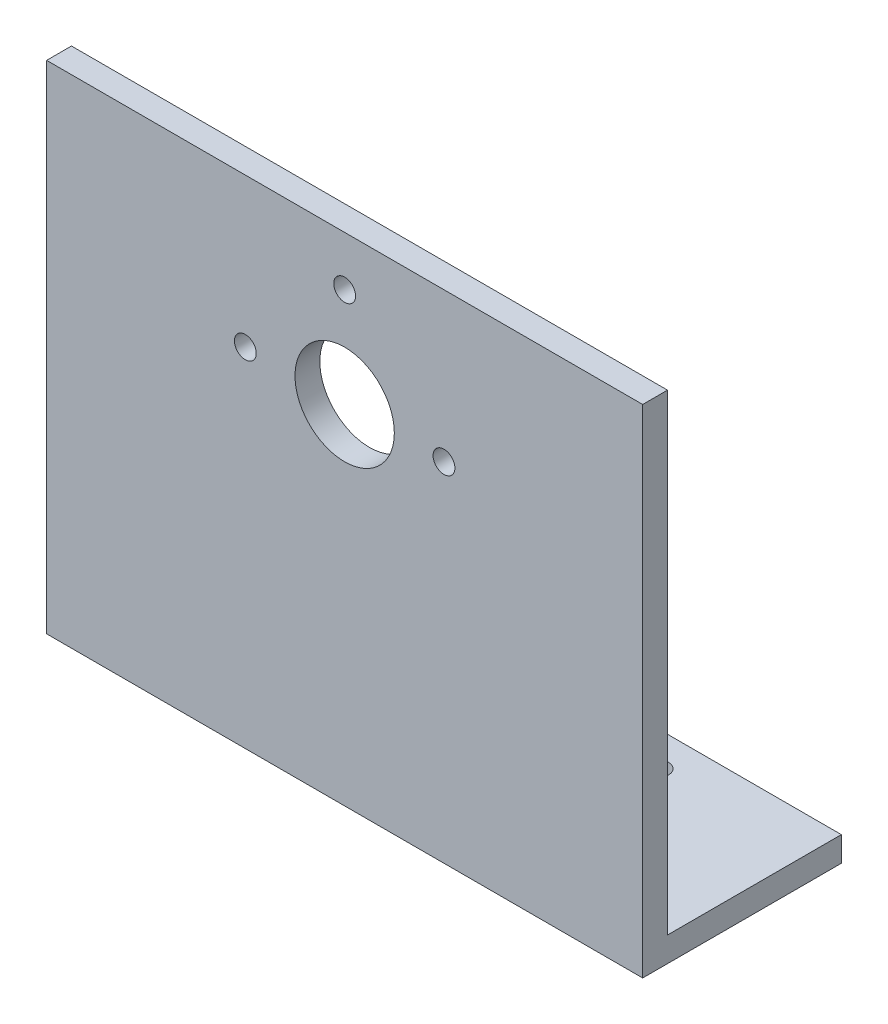
ISO-10303-21;
HEADER;
FILE_DESCRIPTION(('STEP AP214'),'2;1');
FILE_NAME('part.step','',(''),(''),'','','');
FILE_SCHEMA(('AUTOMOTIVE_DESIGN { 1 0 10303 214 1 1 1 1 }'));
ENDSEC;
DATA;
#1=APPLICATION_CONTEXT('core data for automotive mechanical design processes');
#2=APPLICATION_PROTOCOL_DEFINITION('international standard','automotive_design',2000,#1);
#3=PRODUCT_CONTEXT('',#1,'mechanical');
#4=PRODUCT('Part','Part','',(#3));
#5=PRODUCT_RELATED_PRODUCT_CATEGORY('part','',(#4));
#6=PRODUCT_DEFINITION_FORMATION('','',#4);
#7=PRODUCT_DEFINITION_CONTEXT('part definition',#1,'design');
#8=PRODUCT_DEFINITION('design','',#6,#7);
#9=PRODUCT_DEFINITION_SHAPE('','',#8);
#10=(LENGTH_UNIT() NAMED_UNIT(*) SI_UNIT(.MILLI.,.METRE.));
#11=(NAMED_UNIT(*) PLANE_ANGLE_UNIT() SI_UNIT($,.RADIAN.));
#12=(NAMED_UNIT(*) SI_UNIT($,.STERADIAN.) SOLID_ANGLE_UNIT());
#13=UNCERTAINTY_MEASURE_WITH_UNIT(LENGTH_MEASURE(1.E-05),#10,'distance_accuracy_value','');
#14=(GEOMETRIC_REPRESENTATION_CONTEXT(3) GLOBAL_UNCERTAINTY_ASSIGNED_CONTEXT((#13)) GLOBAL_UNIT_ASSIGNED_CONTEXT((#10,
#11,#12)) REPRESENTATION_CONTEXT('',''));
#15=CARTESIAN_POINT('',(0.,0.,0.));
#16=DIRECTION('',(0.,0.,1.));
#17=DIRECTION('',(1.,0.,0.));
#18=AXIS2_PLACEMENT_3D('',#15,#16,#17);
#19=CARTESIAN_POINT('',(-38.1,-44.45,3.175));
#20=DIRECTION('',(0.,0.,-1.));
#21=DIRECTION('',(-1.,0.,0.));
#22=AXIS2_PLACEMENT_3D('',#19,#20,#21);
#23=PLANE('',#22);
#24=CARTESIAN_POINT('',(-12.7,0.,3.175));
#25=DIRECTION('',(0.,0.,1.));
#26=DIRECTION('',(1.,0.,0.));
#27=AXIS2_PLACEMENT_3D('',#24,#25,#26);
#28=CIRCLE('',#27,1.397);
#29=CARTESIAN_POINT('',(-11.303,0.,3.175));
#30=VERTEX_POINT('',#29);
#31=EDGE_CURVE('E149',#30,#30,#28,.T.);
#32=ORIENTED_EDGE('',*,*,#31,.F.);
#33=EDGE_LOOP('',(#32));
#34=FACE_BOUND('',#33,.T.);
#35=CARTESIAN_POINT('',(0.,0.,3.175));
#36=DIRECTION('',(0.,0.,1.));
#37=DIRECTION('',(1.,0.,0.));
#38=AXIS2_PLACEMENT_3D('',#35,#36,#37);
#39=CIRCLE('',#38,6.35);
#40=CARTESIAN_POINT('',(6.35,0.,3.175));
#41=VERTEX_POINT('',#40);
#42=EDGE_CURVE('E161',#41,#41,#39,.T.);
#43=ORIENTED_EDGE('',*,*,#42,.F.);
#44=EDGE_LOOP('',(#43));
#45=FACE_BOUND('',#44,.T.);
#46=DIRECTION('',(0.,-1.,0.));
#47=VECTOR('',#46,1.);
#48=CARTESIAN_POINT('',(-38.1,19.0500000000001,3.175));
#49=LINE('',#48,#47);
#50=CARTESIAN_POINT('',(-38.1,19.0500000000001,3.175));
#51=VERTEX_POINT('',#50);
#52=CARTESIAN_POINT('',(-38.1,-44.45,3.175));
#53=VERTEX_POINT('',#52);
#54=EDGE_CURVE('E167',#51,#53,#49,.T.);
#55=ORIENTED_EDGE('',*,*,#54,.T.);
#56=DIRECTION('',(1.,0.,0.));
#57=VECTOR('',#56,1.);
#58=CARTESIAN_POINT('',(38.1,-44.45,3.175));
#59=LINE('',#58,#57);
#60=CARTESIAN_POINT('',(38.1,-44.45,3.175));
#61=VERTEX_POINT('',#60);
#62=EDGE_CURVE('E81',#53,#61,#59,.T.);
#63=ORIENTED_EDGE('',*,*,#62,.T.);
#64=DIRECTION('',(0.,1.,0.));
#65=VECTOR('',#64,1.);
#66=CARTESIAN_POINT('',(38.1,19.0500000000001,3.175));
#67=LINE('',#66,#65);
#68=CARTESIAN_POINT('',(38.1,19.0500000000001,3.175));
#69=VERTEX_POINT('',#68);
#70=EDGE_CURVE('E103',#61,#69,#67,.T.);
#71=ORIENTED_EDGE('',*,*,#70,.T.);
#72=DIRECTION('',(-1.,0.,0.));
#73=VECTOR('',#72,1.);
#74=CARTESIAN_POINT('',(38.1,19.0500000000001,3.175));
#75=LINE('',#74,#73);
#76=EDGE_CURVE('E59',#69,#51,#75,.T.);
#77=ORIENTED_EDGE('',*,*,#76,.T.);
#78=EDGE_LOOP('',(#55,#63,#71,#77));
#79=FACE_BOUND('',#78,.T.);
#80=CARTESIAN_POINT('',(0.,12.7,3.175));
#81=DIRECTION('',(0.,0.,1.));
#82=DIRECTION('',(1.,0.,0.));
#83=AXIS2_PLACEMENT_3D('',#80,#81,#82);
#84=CIRCLE('',#83,1.397);
#85=CARTESIAN_POINT('',(1.397,12.7,3.175));
#86=VERTEX_POINT('',#85);
#87=EDGE_CURVE('E155',#86,#86,#84,.T.);
#88=ORIENTED_EDGE('',*,*,#87,.F.);
#89=EDGE_LOOP('',(#88));
#90=FACE_BOUND('',#89,.T.);
#91=CARTESIAN_POINT('',(12.7,0.,3.175));
#92=DIRECTION('',(0.,0.,1.));
#93=DIRECTION('',(1.,0.,0.));
#94=AXIS2_PLACEMENT_3D('',#91,#92,#93);
#95=CIRCLE('',#94,1.397);
#96=CARTESIAN_POINT('',(14.097,0.,3.175));
#97=VERTEX_POINT('',#96);
#98=EDGE_CURVE('E129',#97,#97,#95,.T.);
#99=ORIENTED_EDGE('',*,*,#98,.F.);
#100=EDGE_LOOP('',(#99));
#101=FACE_BOUND('',#100,.T.);
#102=ADVANCED_FACE('F33',(#34,#45,#79,#90,#101),#23,.F.);
#103=CARTESIAN_POINT('',(-38.1,-44.45,0.));
#104=DIRECTION('',(0.,0.,-1.));
#105=DIRECTION('',(-1.,0.,0.));
#106=AXIS2_PLACEMENT_3D('',#103,#104,#105);
#107=PLANE('',#106);
#108=DIRECTION('',(1.,0.,0.));
#109=VECTOR('',#108,1.);
#110=CARTESIAN_POINT('',(38.1,-41.275,0.));
#111=LINE('',#110,#109);
#112=CARTESIAN_POINT('',(-38.1,-41.275,0.));
#113=VERTEX_POINT('',#112);
#114=CARTESIAN_POINT('',(38.1,-41.275,0.));
#115=VERTEX_POINT('',#114);
#116=EDGE_CURVE('E50',#113,#115,#111,.T.);
#117=ORIENTED_EDGE('',*,*,#116,.F.);
#118=DIRECTION('',(0.,-1.,0.));
#119=VECTOR('',#118,1.);
#120=CARTESIAN_POINT('',(-38.1,19.0500000000001,0.));
#121=LINE('',#120,#119);
#122=CARTESIAN_POINT('',(-38.1,19.0500000000001,0.));
#123=VERTEX_POINT('',#122);
#124=EDGE_CURVE('E164',#123,#113,#121,.T.);
#125=ORIENTED_EDGE('',*,*,#124,.F.);
#126=DIRECTION('',(-1.,0.,0.));
#127=VECTOR('',#126,1.);
#128=CARTESIAN_POINT('',(38.1,19.0500000000001,0.));
#129=LINE('',#128,#127);
#130=CARTESIAN_POINT('',(38.1,19.0500000000001,0.));
#131=VERTEX_POINT('',#130);
#132=EDGE_CURVE('E74',#131,#123,#129,.T.);
#133=ORIENTED_EDGE('',*,*,#132,.F.);
#134=DIRECTION('',(0.,1.,0.));
#135=VECTOR('',#134,1.);
#136=CARTESIAN_POINT('',(38.1,19.0500000000001,0.));
#137=LINE('',#136,#135);
#138=EDGE_CURVE('E133',#115,#131,#137,.T.);
#139=ORIENTED_EDGE('',*,*,#138,.F.);
#140=EDGE_LOOP('',(#117,#125,#133,#139));
#141=FACE_BOUND('',#140,.T.);
#142=CARTESIAN_POINT('',(-12.7,0.,0.));
#143=DIRECTION('',(0.,0.,1.));
#144=DIRECTION('',(1.,0.,0.));
#145=AXIS2_PLACEMENT_3D('',#142,#143,#144);
#146=CIRCLE('',#145,1.397);
#147=CARTESIAN_POINT('',(-11.303,0.,0.));
#148=VERTEX_POINT('',#147);
#149=EDGE_CURVE('E147',#148,#148,#146,.T.);
#150=ORIENTED_EDGE('',*,*,#149,.T.);
#151=EDGE_LOOP('',(#150));
#152=FACE_BOUND('',#151,.T.);
#153=CARTESIAN_POINT('',(0.,0.,0.));
#154=DIRECTION('',(0.,0.,1.));
#155=DIRECTION('',(1.,0.,0.));
#156=AXIS2_PLACEMENT_3D('',#153,#154,#155);
#157=CIRCLE('',#156,6.35);
#158=CARTESIAN_POINT('',(6.35,0.,0.));
#159=VERTEX_POINT('',#158);
#160=EDGE_CURVE('E158',#159,#159,#157,.T.);
#161=ORIENTED_EDGE('',*,*,#160,.T.);
#162=EDGE_LOOP('',(#161));
#163=FACE_BOUND('',#162,.T.);
#164=CARTESIAN_POINT('',(0.,12.7,0.));
#165=DIRECTION('',(0.,0.,1.));
#166=DIRECTION('',(1.,0.,0.));
#167=AXIS2_PLACEMENT_3D('',#164,#165,#166);
#168=CIRCLE('',#167,1.397);
#169=CARTESIAN_POINT('',(1.397,12.7,0.));
#170=VERTEX_POINT('',#169);
#171=EDGE_CURVE('E152',#170,#170,#168,.T.);
#172=ORIENTED_EDGE('',*,*,#171,.T.);
#173=EDGE_LOOP('',(#172));
#174=FACE_BOUND('',#173,.T.);
#175=CARTESIAN_POINT('',(12.7,0.,0.));
#176=DIRECTION('',(0.,0.,1.));
#177=DIRECTION('',(1.,0.,0.));
#178=AXIS2_PLACEMENT_3D('',#175,#176,#177);
#179=CIRCLE('',#178,1.397);
#180=CARTESIAN_POINT('',(14.097,0.,0.));
#181=VERTEX_POINT('',#180);
#182=EDGE_CURVE('E140',#181,#181,#179,.T.);
#183=ORIENTED_EDGE('',*,*,#182,.T.);
#184=EDGE_LOOP('',(#183));
#185=FACE_BOUND('',#184,.T.);
#186=ADVANCED_FACE('F179',(#141,#152,#163,#174,#185),#107,.T.);
#187=CARTESIAN_POINT('',(-38.1,19.0500000000001,3.175));
#188=DIRECTION('',(1.,0.,0.));
#189=DIRECTION('',(0.,1.,0.));
#190=AXIS2_PLACEMENT_3D('',#187,#188,#189);
#191=PLANE('',#190);
#192=ORIENTED_EDGE('',*,*,#124,.T.);
#193=DIRECTION('',(0.,0.,1.));
#194=VECTOR('',#193,1.);
#195=CARTESIAN_POINT('',(-38.1,-41.275,-22.225));
#196=LINE('',#195,#194);
#197=CARTESIAN_POINT('',(-38.1,-41.275,-22.225));
#198=VERTEX_POINT('',#197);
#199=EDGE_CURVE('E137',#198,#113,#196,.T.);
#200=ORIENTED_EDGE('',*,*,#199,.F.);
#201=DIRECTION('',(0.,1.,0.));
#202=VECTOR('',#201,1.);
#203=CARTESIAN_POINT('',(-38.1,-44.45,-22.225));
#204=LINE('',#203,#202);
#205=CARTESIAN_POINT('',(-38.1,-44.45,-22.225));
#206=VERTEX_POINT('',#205);
#207=EDGE_CURVE('E112',#206,#198,#204,.T.);
#208=ORIENTED_EDGE('',*,*,#207,.F.);
#209=DIRECTION('',(0.,0.,-1.));
#210=VECTOR('',#209,1.);
#211=CARTESIAN_POINT('',(-38.1,-44.45,3.175));
#212=LINE('',#211,#210);
#213=EDGE_CURVE('E11',#53,#206,#212,.T.);
#214=ORIENTED_EDGE('',*,*,#213,.F.);
#215=ORIENTED_EDGE('',*,*,#54,.F.);
#216=DIRECTION('',(0.,0.,-1.));
#217=VECTOR('',#216,1.);
#218=CARTESIAN_POINT('',(-38.1,19.0500000000001,3.175));
#219=LINE('',#218,#217);
#220=EDGE_CURVE('E172',#51,#123,#219,.T.);
#221=ORIENTED_EDGE('',*,*,#220,.T.);
#222=EDGE_LOOP('',(#192,#200,#208,#214,#215,#221));
#223=FACE_BOUND('',#222,.T.);
#224=ADVANCED_FACE('F35',(#223),#191,.F.);
#225=CARTESIAN_POINT('',(38.1,-44.45,3.175));
#226=DIRECTION('',(0.,1.,0.));
#227=DIRECTION('',(-1.,0.,0.));
#228=AXIS2_PLACEMENT_3D('',#225,#226,#227);
#229=PLANE('',#228);
#230=CARTESIAN_POINT('',(19.05,-44.4499999999999,-17.78));
#231=DIRECTION('',(0.,1.,0.));
#232=DIRECTION('',(-1.,0.,0.));
#233=AXIS2_PLACEMENT_3D('',#230,#231,#232);
#234=CIRCLE('',#233,1.397);
#235=CARTESIAN_POINT('',(19.05,-44.4500000000003,-16.383));
#236=VERTEX_POINT('',#235);
#237=EDGE_CURVE('E228',#236,#236,#234,.T.);
#238=ORIENTED_EDGE('',*,*,#237,.T.);
#239=EDGE_LOOP('',(#238));
#240=FACE_BOUND('',#239,.T.);
#241=CARTESIAN_POINT('',(-19.05,-44.4499999999999,-17.78));
#242=DIRECTION('',(0.,1.,0.));
#243=DIRECTION('',(-1.,0.,0.));
#244=AXIS2_PLACEMENT_3D('',#241,#242,#243);
#245=CIRCLE('',#244,1.397);
#246=CARTESIAN_POINT('',(-19.05,-44.4500000000003,-16.383));
#247=VERTEX_POINT('',#246);
#248=EDGE_CURVE('E119',#247,#247,#245,.T.);
#249=ORIENTED_EDGE('',*,*,#248,.T.);
#250=EDGE_LOOP('',(#249));
#251=FACE_BOUND('',#250,.T.);
#252=ORIENTED_EDGE('',*,*,#213,.T.);
#253=DIRECTION('',(-1.,0.,0.));
#254=VECTOR('',#253,1.);
#255=CARTESIAN_POINT('',(38.1,-44.45,-22.225));
#256=LINE('',#255,#254);
#257=CARTESIAN_POINT('',(38.1,-44.45,-22.225));
#258=VERTEX_POINT('',#257);
#259=EDGE_CURVE('E107',#258,#206,#256,.T.);
#260=ORIENTED_EDGE('',*,*,#259,.F.);
#261=DIRECTION('',(0.,0.,-1.));
#262=VECTOR('',#261,1.);
#263=CARTESIAN_POINT('',(38.1,-44.45,3.175));
#264=LINE('',#263,#262);
#265=EDGE_CURVE('E42',#61,#258,#264,.T.);
#266=ORIENTED_EDGE('',*,*,#265,.F.);
#267=ORIENTED_EDGE('',*,*,#62,.F.);
#268=EDGE_LOOP('',(#252,#260,#266,#267));
#269=FACE_BOUND('',#268,.T.);
#270=ADVANCED_FACE('F108',(#240,#251,#269),#229,.F.);
#271=CARTESIAN_POINT('',(38.1,19.0500000000001,3.175));
#272=DIRECTION('',(-1.,0.,0.));
#273=DIRECTION('',(0.,-1.,0.));
#274=AXIS2_PLACEMENT_3D('',#271,#272,#273);
#275=PLANE('',#274);
#276=ORIENTED_EDGE('',*,*,#265,.T.);
#277=DIRECTION('',(0.,-1.,0.));
#278=VECTOR('',#277,1.);
#279=CARTESIAN_POINT('',(38.1,-44.45,-22.225));
#280=LINE('',#279,#278);
#281=CARTESIAN_POINT('',(38.1,-41.275,-22.225));
#282=VERTEX_POINT('',#281);
#283=EDGE_CURVE('E101',#282,#258,#280,.T.);
#284=ORIENTED_EDGE('',*,*,#283,.F.);
#285=DIRECTION('',(0.,0.,1.));
#286=VECTOR('',#285,1.);
#287=CARTESIAN_POINT('',(38.1,-41.275,-22.225));
#288=LINE('',#287,#286);
#289=EDGE_CURVE('E126',#282,#115,#288,.T.);
#290=ORIENTED_EDGE('',*,*,#289,.T.);
#291=ORIENTED_EDGE('',*,*,#138,.T.);
#292=DIRECTION('',(0.,0.,-1.));
#293=VECTOR('',#292,1.);
#294=CARTESIAN_POINT('',(38.1,19.0500000000001,3.175));
#295=LINE('',#294,#293);
#296=EDGE_CURVE('E104',#69,#131,#295,.T.);
#297=ORIENTED_EDGE('',*,*,#296,.F.);
#298=ORIENTED_EDGE('',*,*,#70,.F.);
#299=EDGE_LOOP('',(#276,#284,#290,#291,#297,#298));
#300=FACE_BOUND('',#299,.T.);
#301=ADVANCED_FACE('F98',(#300),#275,.F.);
#302=CARTESIAN_POINT('',(38.1,19.0500000000001,3.175));
#303=DIRECTION('',(0.,-1.,0.));
#304=DIRECTION('',(1.,0.,0.));
#305=AXIS2_PLACEMENT_3D('',#302,#303,#304);
#306=PLANE('',#305);
#307=ORIENTED_EDGE('',*,*,#132,.T.);
#308=ORIENTED_EDGE('',*,*,#220,.F.);
#309=ORIENTED_EDGE('',*,*,#76,.F.);
#310=ORIENTED_EDGE('',*,*,#296,.T.);
#311=EDGE_LOOP('',(#307,#308,#309,#310));
#312=FACE_BOUND('',#311,.T.);
#313=ADVANCED_FACE('F178',(#312),#306,.F.);
#314=CARTESIAN_POINT('',(0.,0.,3.175));
#315=DIRECTION('',(0.,0.,-1.));
#316=DIRECTION('',(-1.,0.,0.));
#317=AXIS2_PLACEMENT_3D('',#314,#315,#316);
#318=CYLINDRICAL_SURFACE('',#317,6.35);
#319=ORIENTED_EDGE('',*,*,#42,.T.);
#320=EDGE_LOOP('',(#319));
#321=FACE_BOUND('',#320,.T.);
#322=ORIENTED_EDGE('',*,*,#160,.F.);
#323=EDGE_LOOP('',(#322));
#324=FACE_BOUND('',#323,.T.);
#325=ADVANCED_FACE('F210',(#321,#324),#318,.F.);
#326=CARTESIAN_POINT('',(0.,12.7,3.175));
#327=DIRECTION('',(0.,0.,-1.));
#328=DIRECTION('',(-1.,0.,0.));
#329=AXIS2_PLACEMENT_3D('',#326,#327,#328);
#330=CYLINDRICAL_SURFACE('',#329,1.397);
#331=ORIENTED_EDGE('',*,*,#87,.T.);
#332=EDGE_LOOP('',(#331));
#333=FACE_BOUND('',#332,.T.);
#334=ORIENTED_EDGE('',*,*,#171,.F.);
#335=EDGE_LOOP('',(#334));
#336=FACE_BOUND('',#335,.T.);
#337=ADVANCED_FACE('F203',(#333,#336),#330,.F.);
#338=CARTESIAN_POINT('',(-12.7,0.,3.175));
#339=DIRECTION('',(0.,0.,-1.));
#340=DIRECTION('',(-1.,0.,0.));
#341=AXIS2_PLACEMENT_3D('',#338,#339,#340);
#342=CYLINDRICAL_SURFACE('',#341,1.397);
#343=ORIENTED_EDGE('',*,*,#31,.T.);
#344=EDGE_LOOP('',(#343));
#345=FACE_BOUND('',#344,.T.);
#346=ORIENTED_EDGE('',*,*,#149,.F.);
#347=EDGE_LOOP('',(#346));
#348=FACE_BOUND('',#347,.T.);
#349=ADVANCED_FACE('F195',(#345,#348),#342,.F.);
#350=CARTESIAN_POINT('',(12.7,0.,3.175));
#351=DIRECTION('',(0.,0.,-1.));
#352=DIRECTION('',(-1.,0.,0.));
#353=AXIS2_PLACEMENT_3D('',#350,#351,#352);
#354=CYLINDRICAL_SURFACE('',#353,1.397);
#355=ORIENTED_EDGE('',*,*,#98,.T.);
#356=EDGE_LOOP('',(#355));
#357=FACE_BOUND('',#356,.T.);
#358=ORIENTED_EDGE('',*,*,#182,.F.);
#359=EDGE_LOOP('',(#358));
#360=FACE_BOUND('',#359,.T.);
#361=ADVANCED_FACE('F191',(#357,#360),#354,.F.);
#362=CARTESIAN_POINT('',(38.1,-41.275,-22.225));
#363=DIRECTION('',(0.,-1.,0.));
#364=DIRECTION('',(0.,0.,-1.));
#365=AXIS2_PLACEMENT_3D('',#362,#363,#364);
#366=PLANE('',#365);
#367=CARTESIAN_POINT('',(19.05,-41.275,-17.78));
#368=DIRECTION('',(0.,1.,0.));
#369=DIRECTION('',(0.,0.,1.));
#370=AXIS2_PLACEMENT_3D('',#367,#368,#369);
#371=CIRCLE('',#370,1.397);
#372=CARTESIAN_POINT('',(19.05,-41.2749999999997,-16.383));
#373=VERTEX_POINT('',#372);
#374=EDGE_CURVE('E236',#373,#373,#371,.T.);
#375=ORIENTED_EDGE('',*,*,#374,.F.);
#376=EDGE_LOOP('',(#375));
#377=FACE_BOUND('',#376,.T.);
#378=CARTESIAN_POINT('',(-19.05,-41.275,-17.78));
#379=DIRECTION('',(0.,1.,0.));
#380=DIRECTION('',(0.,0.,1.));
#381=AXIS2_PLACEMENT_3D('',#378,#379,#380);
#382=CIRCLE('',#381,1.397);
#383=CARTESIAN_POINT('',(-19.05,-41.2749999999997,-16.383));
#384=VERTEX_POINT('',#383);
#385=EDGE_CURVE('E232',#384,#384,#382,.T.);
#386=ORIENTED_EDGE('',*,*,#385,.F.);
#387=EDGE_LOOP('',(#386));
#388=FACE_BOUND('',#387,.T.);
#389=ORIENTED_EDGE('',*,*,#116,.T.);
#390=ORIENTED_EDGE('',*,*,#289,.F.);
#391=DIRECTION('',(1.,0.,0.));
#392=VECTOR('',#391,1.);
#393=CARTESIAN_POINT('',(38.1,-41.275,-22.225));
#394=LINE('',#393,#392);
#395=EDGE_CURVE('E116',#198,#282,#394,.T.);
#396=ORIENTED_EDGE('',*,*,#395,.F.);
#397=ORIENTED_EDGE('',*,*,#199,.T.);
#398=EDGE_LOOP('',(#389,#390,#396,#397));
#399=FACE_BOUND('',#398,.T.);
#400=ADVANCED_FACE('F194',(#377,#388,#399),#366,.F.);
#401=CARTESIAN_POINT('',(38.1,-41.275,-22.225));
#402=DIRECTION('',(0.,0.,1.));
#403=DIRECTION('',(1.,0.,0.));
#404=AXIS2_PLACEMENT_3D('',#401,#402,#403);
#405=PLANE('',#404);
#406=ORIENTED_EDGE('',*,*,#283,.T.);
#407=ORIENTED_EDGE('',*,*,#259,.T.);
#408=ORIENTED_EDGE('',*,*,#207,.T.);
#409=ORIENTED_EDGE('',*,*,#395,.T.);
#410=EDGE_LOOP('',(#406,#407,#408,#409));
#411=FACE_BOUND('',#410,.T.);
#412=ADVANCED_FACE('F114',(#411),#405,.F.);
#413=CARTESIAN_POINT('',(-19.05,-3216.275,-17.78));
#414=DIRECTION('',(0.,1.,0.));
#415=DIRECTION('',(0.,0.,1.));
#416=AXIS2_PLACEMENT_3D('',#413,#414,#415);
#417=CYLINDRICAL_SURFACE('',#416,1.397);
#418=CARTESIAN_POINT('',(-19.05,-41.2749999999997,-16.383));
#419=CARTESIAN_POINT('',(-19.05,-41.3080729166664,-16.383));
#420=CARTESIAN_POINT('',(-19.05,-41.341145833333,-16.383));
#421=CARTESIAN_POINT('',(-19.05,-41.4072916666663,-16.383));
#422=CARTESIAN_POINT('',(-19.05,-41.440364583333,-16.383));
#423=CARTESIAN_POINT('',(-19.05,-41.5065104166663,-16.383));
#424=CARTESIAN_POINT('',(-19.05,-41.539583333333,-16.383));
#425=CARTESIAN_POINT('',(-19.05,-41.6057291666663,-16.383));
#426=CARTESIAN_POINT('',(-19.05,-41.6388020833329,-16.383));
#427=CARTESIAN_POINT('',(-19.05,-41.7049479166664,-16.383));
#428=CARTESIAN_POINT('',(-19.05,-41.7380208333332,-16.383));
#429=CARTESIAN_POINT('',(-19.05,-41.8041666666666,-16.383));
#430=CARTESIAN_POINT('',(-19.05,-41.8372395833333,-16.383));
#431=CARTESIAN_POINT('',(-19.05,-41.9033854166666,-16.383));
#432=CARTESIAN_POINT('',(-19.05,-41.9364583333333,-16.383));
#433=CARTESIAN_POINT('',(-19.05,-42.0026041666666,-16.383));
#434=CARTESIAN_POINT('',(-19.05,-42.0356770833332,-16.383));
#435=CARTESIAN_POINT('',(-19.05,-42.1018229166665,-16.383));
#436=CARTESIAN_POINT('',(-19.05,-42.1348958333332,-16.383));
#437=CARTESIAN_POINT('',(-19.05,-42.2010416666665,-16.383));
#438=CARTESIAN_POINT('',(-19.05,-42.2341145833332,-16.383));
#439=CARTESIAN_POINT('',(-19.05,-42.3002604166665,-16.383));
#440=CARTESIAN_POINT('',(-19.05,-42.3333333333331,-16.383));
#441=CARTESIAN_POINT('',(-19.05,-42.3994791666666,-16.383));
#442=CARTESIAN_POINT('',(-19.05,-42.4325520833334,-16.383));
#443=CARTESIAN_POINT('',(-19.05,-42.4986979166668,-16.383));
#444=CARTESIAN_POINT('',(-19.05,-42.5317708333335,-16.383));
#445=CARTESIAN_POINT('',(-19.05,-42.5979166666668,-16.383));
#446=CARTESIAN_POINT('',(-19.05,-42.6309895833334,-16.383));
#447=CARTESIAN_POINT('',(-19.05,-42.6971354166668,-16.383));
#448=CARTESIAN_POINT('',(-19.05,-42.7302083333334,-16.383));
#449=CARTESIAN_POINT('',(-19.05,-42.7963541666667,-16.383));
#450=CARTESIAN_POINT('',(-19.05,-42.8294270833334,-16.383));
#451=CARTESIAN_POINT('',(-19.05,-42.8955729166667,-16.383));
#452=CARTESIAN_POINT('',(-19.05,-42.9286458333333,-16.383));
#453=CARTESIAN_POINT('',(-19.05,-42.9947916666666,-16.383));
#454=CARTESIAN_POINT('',(-19.05,-43.0278645833333,-16.383));
#455=CARTESIAN_POINT('',(-19.05,-43.0940104166666,-16.383));
#456=CARTESIAN_POINT('',(-19.05,-43.1270833333333,-16.383));
#457=CARTESIAN_POINT('',(-19.05,-43.1932291666666,-16.383));
#458=CARTESIAN_POINT('',(-19.05,-43.2263020833332,-16.383));
#459=CARTESIAN_POINT('',(-19.05,-43.2924479166667,-16.383));
#460=CARTESIAN_POINT('',(-19.05,-43.3255208333335,-16.383));
#461=CARTESIAN_POINT('',(-19.05,-43.3916666666669,-16.383));
#462=CARTESIAN_POINT('',(-19.05,-43.4247395833336,-16.383));
#463=CARTESIAN_POINT('',(-19.05,-43.4908854166669,-16.383));
#464=CARTESIAN_POINT('',(-19.05,-43.5239583333336,-16.383));
#465=CARTESIAN_POINT('',(-19.05,-43.5901041666669,-16.383));
#466=CARTESIAN_POINT('',(-19.05,-43.6231770833335,-16.383));
#467=CARTESIAN_POINT('',(-19.05,-43.6893229166668,-16.383));
#468=CARTESIAN_POINT('',(-19.05,-43.7223958333335,-16.383));
#469=CARTESIAN_POINT('',(-19.05,-43.7885416666668,-16.383));
#470=CARTESIAN_POINT('',(-19.05,-43.8216145833334,-16.383));
#471=CARTESIAN_POINT('',(-19.05,-43.8877604166668,-16.383));
#472=CARTESIAN_POINT('',(-19.05,-43.9208333333334,-16.383));
#473=CARTESIAN_POINT('',(-19.05,-43.9869791666669,-16.383));
#474=CARTESIAN_POINT('',(-19.05,-44.0200520833337,-16.383));
#475=CARTESIAN_POINT('',(-19.05,-44.0861979166671,-16.383));
#476=CARTESIAN_POINT('',(-19.05,-44.1192708333338,-16.383));
#477=CARTESIAN_POINT('',(-19.05,-44.1854166666671,-16.383));
#478=CARTESIAN_POINT('',(-19.05,-44.2184895833337,-16.383));
#479=CARTESIAN_POINT('',(-19.05,-44.2846354166671,-16.383));
#480=CARTESIAN_POINT('',(-19.05,-44.3177083333337,-16.383));
#481=CARTESIAN_POINT('',(-19.05,-44.383854166667,-16.383));
#482=CARTESIAN_POINT('',(-19.05,-44.4169270833337,-16.383));
#483=CARTESIAN_POINT('',(-19.05,-44.4500000000003,-16.383));
#484=B_SPLINE_CURVE_WITH_KNOTS('',3,(#418,#419,#420,#421,#422,#423,#424,#425,#426,#427,#428,
#429,#430,#431,#432,#433,#434,#435,#436,#437,#438,#439,#440,#441,#442,#443,#444,#445,#446,#447,
#448,#449,#450,#451,#452,#453,#454,#455,#456,#457,#458,#459,#460,#461,#462,#463,#464,#465,#466,
#467,#468,#469,#470,#471,#472,#473,#474,#475,#476,#477,#478,#479,#480,#481,#482,#483),
.UNSPECIFIED.,.F.,.F.,(4,2,2,2,2,2,2,2,2,2,2,2,2,2,2,2,2,2,2,2,2,2,2,2,2,2,2,2,2,2,2,2,4),(0.,
0.0992187499999631,0.198437499999926,0.297656249999889,0.396874999999852,0.496093750000259,
0.595312500000222,0.694531250000185,0.793750000000149,0.892968750000112,0.992187500000075,
1.09140625000004,1.19062500000044,1.28984375000041,1.38906250000037,1.48828125000033,
1.5875000000003,1.68671875000026,1.78593750000022,1.88515625000019,1.98437500000015,
2.08359375000056,2.18281250000052,2.28203125000048,2.38125000000045,2.48046875000041,
2.57968750000037,2.67890625000033,2.77812500000074,2.8773437500007,2.97656250000067,
3.07578125000063,3.17500000000059),.UNSPECIFIED.);
#485=EDGE_CURVE('BSEAM246',#384,#247,#484,.T.);
#486=ORIENTED_EDGE('',*,*,#385,.T.);
#487=ORIENTED_EDGE('',*,*,#248,.F.);
#488=ORIENTED_EDGE('',*,*,#485,.T.);
#489=ORIENTED_EDGE('',*,*,#485,.F.);
#490=EDGE_LOOP('',(#486,#488,#487,#489));
#491=FACE_BOUND('',#490,.T.);
#492=ADVANCED_FACE('F246',(#491),#417,.F.);
#493=CARTESIAN_POINT('',(19.05,-3216.275,-17.78));
#494=DIRECTION('',(0.,1.,0.));
#495=DIRECTION('',(0.,0.,1.));
#496=AXIS2_PLACEMENT_3D('',#493,#494,#495);
#497=CYLINDRICAL_SURFACE('',#496,1.397);
#498=CARTESIAN_POINT('',(19.05,-41.2749999999997,-16.383));
#499=CARTESIAN_POINT('',(19.05,-41.3080729166664,-16.383));
#500=CARTESIAN_POINT('',(19.05,-41.341145833333,-16.383));
#501=CARTESIAN_POINT('',(19.05,-41.4072916666663,-16.383));
#502=CARTESIAN_POINT('',(19.05,-41.440364583333,-16.383));
#503=CARTESIAN_POINT('',(19.05,-41.5065104166663,-16.383));
#504=CARTESIAN_POINT('',(19.05,-41.539583333333,-16.383));
#505=CARTESIAN_POINT('',(19.05,-41.6057291666663,-16.383));
#506=CARTESIAN_POINT('',(19.05,-41.6388020833329,-16.383));
#507=CARTESIAN_POINT('',(19.05,-41.7049479166664,-16.383));
#508=CARTESIAN_POINT('',(19.05,-41.7380208333332,-16.383));
#509=CARTESIAN_POINT('',(19.05,-41.8041666666666,-16.383));
#510=CARTESIAN_POINT('',(19.05,-41.8372395833333,-16.383));
#511=CARTESIAN_POINT('',(19.05,-41.9033854166666,-16.383));
#512=CARTESIAN_POINT('',(19.05,-41.9364583333333,-16.383));
#513=CARTESIAN_POINT('',(19.05,-42.0026041666666,-16.383));
#514=CARTESIAN_POINT('',(19.05,-42.0356770833332,-16.383));
#515=CARTESIAN_POINT('',(19.05,-42.1018229166665,-16.383));
#516=CARTESIAN_POINT('',(19.05,-42.1348958333332,-16.383));
#517=CARTESIAN_POINT('',(19.05,-42.2010416666665,-16.383));
#518=CARTESIAN_POINT('',(19.05,-42.2341145833332,-16.383));
#519=CARTESIAN_POINT('',(19.05,-42.3002604166665,-16.383));
#520=CARTESIAN_POINT('',(19.05,-42.3333333333331,-16.383));
#521=CARTESIAN_POINT('',(19.05,-42.3994791666666,-16.383));
#522=CARTESIAN_POINT('',(19.05,-42.4325520833334,-16.383));
#523=CARTESIAN_POINT('',(19.05,-42.4986979166668,-16.383));
#524=CARTESIAN_POINT('',(19.05,-42.5317708333335,-16.383));
#525=CARTESIAN_POINT('',(19.05,-42.5979166666668,-16.383));
#526=CARTESIAN_POINT('',(19.05,-42.6309895833334,-16.383));
#527=CARTESIAN_POINT('',(19.05,-42.6971354166668,-16.383));
#528=CARTESIAN_POINT('',(19.05,-42.7302083333334,-16.383));
#529=CARTESIAN_POINT('',(19.05,-42.7963541666667,-16.383));
#530=CARTESIAN_POINT('',(19.05,-42.8294270833334,-16.383));
#531=CARTESIAN_POINT('',(19.05,-42.8955729166667,-16.383));
#532=CARTESIAN_POINT('',(19.05,-42.9286458333333,-16.383));
#533=CARTESIAN_POINT('',(19.05,-42.9947916666666,-16.383));
#534=CARTESIAN_POINT('',(19.05,-43.0278645833333,-16.383));
#535=CARTESIAN_POINT('',(19.05,-43.0940104166666,-16.383));
#536=CARTESIAN_POINT('',(19.05,-43.1270833333333,-16.383));
#537=CARTESIAN_POINT('',(19.05,-43.1932291666666,-16.383));
#538=CARTESIAN_POINT('',(19.05,-43.2263020833332,-16.383));
#539=CARTESIAN_POINT('',(19.05,-43.2924479166667,-16.383));
#540=CARTESIAN_POINT('',(19.05,-43.3255208333335,-16.383));
#541=CARTESIAN_POINT('',(19.05,-43.3916666666669,-16.383));
#542=CARTESIAN_POINT('',(19.05,-43.4247395833336,-16.383));
#543=CARTESIAN_POINT('',(19.05,-43.4908854166669,-16.383));
#544=CARTESIAN_POINT('',(19.05,-43.5239583333336,-16.383));
#545=CARTESIAN_POINT('',(19.05,-43.5901041666669,-16.383));
#546=CARTESIAN_POINT('',(19.05,-43.6231770833335,-16.383));
#547=CARTESIAN_POINT('',(19.05,-43.6893229166668,-16.383));
#548=CARTESIAN_POINT('',(19.05,-43.7223958333335,-16.383));
#549=CARTESIAN_POINT('',(19.05,-43.7885416666668,-16.383));
#550=CARTESIAN_POINT('',(19.05,-43.8216145833334,-16.383));
#551=CARTESIAN_POINT('',(19.05,-43.8877604166668,-16.383));
#552=CARTESIAN_POINT('',(19.05,-43.9208333333334,-16.383));
#553=CARTESIAN_POINT('',(19.05,-43.9869791666669,-16.383));
#554=CARTESIAN_POINT('',(19.05,-44.0200520833337,-16.383));
#555=CARTESIAN_POINT('',(19.05,-44.0861979166671,-16.383));
#556=CARTESIAN_POINT('',(19.05,-44.1192708333338,-16.383));
#557=CARTESIAN_POINT('',(19.05,-44.1854166666671,-16.383));
#558=CARTESIAN_POINT('',(19.05,-44.2184895833337,-16.383));
#559=CARTESIAN_POINT('',(19.05,-44.2846354166671,-16.383));
#560=CARTESIAN_POINT('',(19.05,-44.3177083333337,-16.383));
#561=CARTESIAN_POINT('',(19.05,-44.383854166667,-16.383));
#562=CARTESIAN_POINT('',(19.05,-44.4169270833337,-16.383));
#563=CARTESIAN_POINT('',(19.05,-44.4500000000003,-16.383));
#564=B_SPLINE_CURVE_WITH_KNOTS('',3,(#498,#499,#500,#501,#502,#503,#504,#505,#506,#507,#508,
#509,#510,#511,#512,#513,#514,#515,#516,#517,#518,#519,#520,#521,#522,#523,#524,#525,#526,#527,
#528,#529,#530,#531,#532,#533,#534,#535,#536,#537,#538,#539,#540,#541,#542,#543,#544,#545,#546,
#547,#548,#549,#550,#551,#552,#553,#554,#555,#556,#557,#558,#559,#560,#561,#562,#563),
.UNSPECIFIED.,.F.,.F.,(4,2,2,2,2,2,2,2,2,2,2,2,2,2,2,2,2,2,2,2,2,2,2,2,2,2,2,2,2,2,2,2,4),(0.,
0.0992187499999631,0.198437499999926,0.297656249999889,0.396874999999852,0.496093750000259,
0.595312500000222,0.694531250000185,0.793750000000149,0.892968750000112,0.992187500000075,
1.09140625000004,1.19062500000044,1.28984375000041,1.38906250000037,1.48828125000033,
1.5875000000003,1.68671875000026,1.78593750000022,1.88515625000019,1.98437500000015,
2.08359375000056,2.18281250000052,2.28203125000048,2.38125000000045,2.48046875000041,
2.57968750000037,2.67890625000033,2.77812500000074,2.8773437500007,2.97656250000067,
3.07578125000063,3.17500000000059),.UNSPECIFIED.);
#565=EDGE_CURVE('BSEAM242',#373,#236,#564,.T.);
#566=ORIENTED_EDGE('',*,*,#374,.T.);
#567=ORIENTED_EDGE('',*,*,#237,.F.);
#568=ORIENTED_EDGE('',*,*,#565,.T.);
#569=ORIENTED_EDGE('',*,*,#565,.F.);
#570=EDGE_LOOP('',(#566,#568,#567,#569));
#571=FACE_BOUND('',#570,.T.);
#572=ADVANCED_FACE('F242',(#571),#497,.F.);
#573=CLOSED_SHELL('',(#102,#186,#224,#270,#301,#313,#325,#337,#349,#361,#400,#412,#492,#572));
#574=MANIFOLD_SOLID_BREP('B2',#573);
#575=ADVANCED_BREP_SHAPE_REPRESENTATION('',(#18,#574),#14);
#576=SHAPE_DEFINITION_REPRESENTATION(#9,#575);
ENDSEC;
END-ISO-10303-21;
